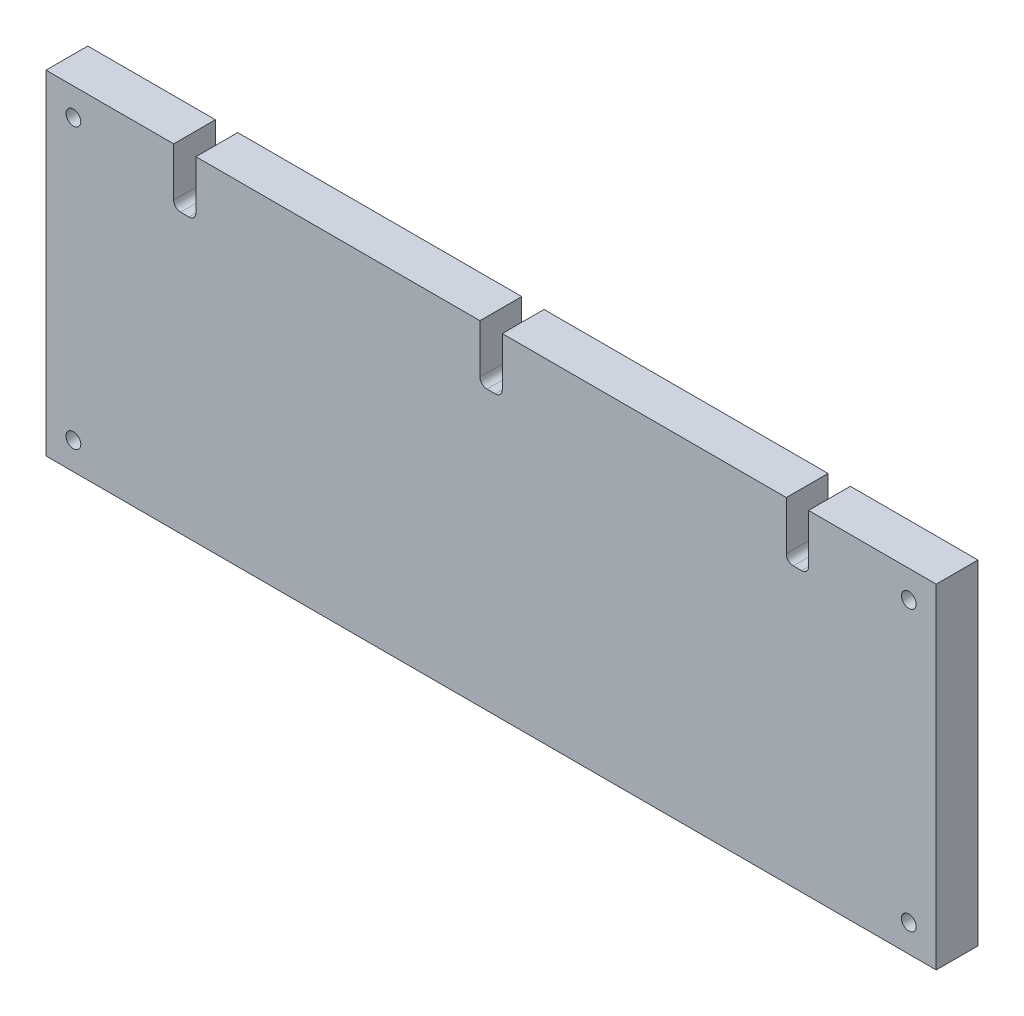
ISO-10303-21;
HEADER;
FILE_DESCRIPTION(('STEP AP214'),'2;1');
FILE_NAME('part.step','',(''),(''),'','','');
FILE_SCHEMA(('AUTOMOTIVE_DESIGN { 1 0 10303 214 1 1 1 1 }'));
ENDSEC;
DATA;
#1=APPLICATION_CONTEXT('core data for automotive mechanical design processes');
#2=APPLICATION_PROTOCOL_DEFINITION('international standard','automotive_design',2000,#1);
#3=PRODUCT_CONTEXT('',#1,'mechanical');
#4=PRODUCT('Part','Part','',(#3));
#5=PRODUCT_RELATED_PRODUCT_CATEGORY('part','',(#4));
#6=PRODUCT_DEFINITION_FORMATION('','',#4);
#7=PRODUCT_DEFINITION_CONTEXT('part definition',#1,'design');
#8=PRODUCT_DEFINITION('design','',#6,#7);
#9=PRODUCT_DEFINITION_SHAPE('','',#8);
#10=(LENGTH_UNIT() NAMED_UNIT(*) SI_UNIT(.MILLI.,.METRE.));
#11=(NAMED_UNIT(*) PLANE_ANGLE_UNIT() SI_UNIT($,.RADIAN.));
#12=(NAMED_UNIT(*) SI_UNIT($,.STERADIAN.) SOLID_ANGLE_UNIT());
#13=UNCERTAINTY_MEASURE_WITH_UNIT(LENGTH_MEASURE(1.E-05),#10,'distance_accuracy_value','');
#14=(GEOMETRIC_REPRESENTATION_CONTEXT(3) GLOBAL_UNCERTAINTY_ASSIGNED_CONTEXT((#13)) GLOBAL_UNIT_ASSIGNED_CONTEXT((#10,
#11,#12)) REPRESENTATION_CONTEXT('',''));
#15=CARTESIAN_POINT('',(0.,0.,0.));
#16=DIRECTION('',(0.,0.,1.));
#17=DIRECTION('',(1.,0.,0.));
#18=AXIS2_PLACEMENT_3D('',#15,#16,#17);
#19=CARTESIAN_POINT('',(-229.,139.9,19.05));
#20=DIRECTION('',(0.,-1.,0.));
#21=DIRECTION('',(1.,0.,0.));
#22=AXIS2_PLACEMENT_3D('',#19,#20,#21);
#23=PLANE('',#22);
#24=DIRECTION('',(-1.,0.,0.));
#25=VECTOR('',#24,1.);
#26=CARTESIAN_POINT('',(-229.,139.9,0.));
#27=LINE('',#26,#25);
#28=CARTESIAN_POINT('',(-229.,139.9,0.));
#29=VERTEX_POINT('',#28);
#30=CARTESIAN_POINT('',(-287.22,139.9,0.));
#31=VERTEX_POINT('',#30);
#32=EDGE_CURVE('E222',#29,#31,#27,.T.);
#33=ORIENTED_EDGE('',*,*,#32,.T.);
#34=DIRECTION('',(0.,0.,1.));
#35=VECTOR('',#34,1.);
#36=CARTESIAN_POINT('',(-287.22,139.9,0.));
#37=LINE('',#36,#35);
#38=CARTESIAN_POINT('',(-287.22,139.9,19.05));
#39=VERTEX_POINT('',#38);
#40=EDGE_CURVE('E292',#31,#39,#37,.T.);
#41=ORIENTED_EDGE('',*,*,#40,.T.);
#42=DIRECTION('',(-1.,0.,0.));
#43=VECTOR('',#42,1.);
#44=CARTESIAN_POINT('',(-229.,139.9,19.05));
#45=LINE('',#44,#43);
#46=CARTESIAN_POINT('',(-229.,139.9,19.05));
#47=VERTEX_POINT('',#46);
#48=EDGE_CURVE('E274',#47,#39,#45,.T.);
#49=ORIENTED_EDGE('',*,*,#48,.F.);
#50=DIRECTION('',(0.,0.,-1.));
#51=VECTOR('',#50,1.);
#52=CARTESIAN_POINT('',(-229.,139.9,19.05));
#53=LINE('',#52,#51);
#54=EDGE_CURVE('E11',#47,#29,#53,.T.);
#55=ORIENTED_EDGE('',*,*,#54,.T.);
#56=EDGE_LOOP('',(#33,#41,#49,#55));
#57=FACE_BOUND('',#56,.T.);
#58=ADVANCED_FACE('F41',(#57),#23,.F.);
#59=CARTESIAN_POINT('',(-437.08,139.9,0.));
#60=VERTEX_POINT('',#59);
#61=CARTESIAN_POINT('',(-566.62,139.9,0.));
#62=VERTEX_POINT('',#61);
#63=EDGE_CURVE('E211',#60,#62,#27,.T.);
#64=ORIENTED_EDGE('',*,*,#63,.T.);
#65=DIRECTION('',(0.,0.,1.));
#66=VECTOR('',#65,1.);
#67=CARTESIAN_POINT('',(-566.62,139.9,0.));
#68=LINE('',#67,#66);
#69=CARTESIAN_POINT('',(-566.62,139.9,19.05));
#70=VERTEX_POINT('',#69);
#71=EDGE_CURVE('E192',#62,#70,#68,.T.);
#72=ORIENTED_EDGE('',*,*,#71,.T.);
#73=CARTESIAN_POINT('',(-437.08,139.9,19.05));
#74=VERTEX_POINT('',#73);
#75=EDGE_CURVE('E279',#74,#70,#45,.T.);
#76=ORIENTED_EDGE('',*,*,#75,.F.);
#77=DIRECTION('',(0.,0.,1.));
#78=VECTOR('',#77,1.);
#79=CARTESIAN_POINT('',(-437.08,139.9,0.));
#80=LINE('',#79,#78);
#81=EDGE_CURVE('E218',#60,#74,#80,.T.);
#82=ORIENTED_EDGE('',*,*,#81,.F.);
#83=EDGE_LOOP('',(#64,#72,#76,#82));
#84=FACE_BOUND('',#83,.T.);
#85=ADVANCED_FACE('F217',(#84),#23,.F.);
#86=CARTESIAN_POINT('',(-297.38,139.9,19.05));
#87=VERTEX_POINT('',#86);
#88=CARTESIAN_POINT('',(-426.92,139.9,19.05));
#89=VERTEX_POINT('',#88);
#90=EDGE_CURVE('E278',#87,#89,#45,.T.);
#91=ORIENTED_EDGE('',*,*,#90,.F.);
#92=DIRECTION('',(0.,0.,1.));
#93=VECTOR('',#92,1.);
#94=CARTESIAN_POINT('',(-297.38,139.9,0.));
#95=LINE('',#94,#93);
#96=CARTESIAN_POINT('',(-297.38,139.9,0.));
#97=VERTEX_POINT('',#96);
#98=EDGE_CURVE('E348',#97,#87,#95,.T.);
#99=ORIENTED_EDGE('',*,*,#98,.F.);
#100=CARTESIAN_POINT('',(-426.92,139.9,0.));
#101=VERTEX_POINT('',#100);
#102=EDGE_CURVE('E219',#97,#101,#27,.T.);
#103=ORIENTED_EDGE('',*,*,#102,.T.);
#104=DIRECTION('',(0.,0.,1.));
#105=VECTOR('',#104,1.);
#106=CARTESIAN_POINT('',(-426.92,139.9,0.));
#107=LINE('',#106,#105);
#108=EDGE_CURVE('E366',#101,#89,#107,.T.);
#109=ORIENTED_EDGE('',*,*,#108,.T.);
#110=EDGE_LOOP('',(#91,#99,#103,#109));
#111=FACE_BOUND('',#110,.T.);
#112=ADVANCED_FACE('F394',(#111),#23,.F.);
#113=CARTESIAN_POINT('',(0.,0.,19.05));
#114=DIRECTION('',(0.,0.,1.));
#115=DIRECTION('',(1.,0.,0.));
#116=AXIS2_PLACEMENT_3D('',#113,#114,#115);
#117=PLANE('',#116);
#118=DIRECTION('',(0.,1.,0.));
#119=VECTOR('',#118,1.);
#120=CARTESIAN_POINT('',(-566.62,117.675,19.05));
#121=LINE('',#120,#119);
#122=CARTESIAN_POINT('',(-566.62,117.675,19.05));
#123=VERTEX_POINT('',#122);
#124=EDGE_CURVE('E198',#123,#70,#121,.T.);
#125=ORIENTED_EDGE('',*,*,#124,.F.);
#126=CARTESIAN_POINT('',(-569.795,117.675,19.05));
#127=DIRECTION('',(0.,0.,1.));
#128=DIRECTION('',(1.,0.,0.));
#129=AXIS2_PLACEMENT_3D('',#126,#127,#128);
#130=CIRCLE('',#129,3.17499999999999);
#131=CARTESIAN_POINT('',(-569.795,114.5,19.05));
#132=VERTEX_POINT('',#131);
#133=EDGE_CURVE('E214',#132,#123,#130,.T.);
#134=ORIENTED_EDGE('',*,*,#133,.F.);
#135=DIRECTION('',(1.,0.,0.));
#136=VECTOR('',#135,1.);
#137=CARTESIAN_POINT('',(-573.605,114.5,19.05));
#138=LINE('',#137,#136);
#139=CARTESIAN_POINT('',(-573.605,114.5,19.05));
#140=VERTEX_POINT('',#139);
#141=EDGE_CURVE('E415',#140,#132,#138,.T.);
#142=ORIENTED_EDGE('',*,*,#141,.F.);
#143=CARTESIAN_POINT('',(-573.605,117.675,19.05));
#144=DIRECTION('',(0.,0.,1.));
#145=DIRECTION('',(-1.,0.,0.));
#146=AXIS2_PLACEMENT_3D('',#143,#144,#145);
#147=CIRCLE('',#146,3.17499999999999);
#148=CARTESIAN_POINT('',(-576.78,117.675,19.05));
#149=VERTEX_POINT('',#148);
#150=EDGE_CURVE('E413',#149,#140,#147,.T.);
#151=ORIENTED_EDGE('',*,*,#150,.F.);
#152=DIRECTION('',(0.,-1.,0.));
#153=VECTOR('',#152,1.);
#154=CARTESIAN_POINT('',(-576.78,117.675,19.05));
#155=LINE('',#154,#153);
#156=CARTESIAN_POINT('',(-576.78,139.9,19.05));
#157=VERTEX_POINT('',#156);
#158=EDGE_CURVE('E410',#157,#149,#155,.T.);
#159=ORIENTED_EDGE('',*,*,#158,.F.);
#160=CARTESIAN_POINT('',(-635.,139.9,19.05));
#161=VERTEX_POINT('',#160);
#162=EDGE_CURVE('E273',#157,#161,#45,.T.);
#163=ORIENTED_EDGE('',*,*,#162,.T.);
#164=DIRECTION('',(0.,-1.,0.));
#165=VECTOR('',#164,1.);
#166=CARTESIAN_POINT('',(-635.,-12.5,19.05));
#167=LINE('',#166,#165);
#168=CARTESIAN_POINT('',(-635.,-12.5,19.05));
#169=VERTEX_POINT('',#168);
#170=EDGE_CURVE('E277',#161,#169,#167,.T.);
#171=ORIENTED_EDGE('',*,*,#170,.T.);
#172=DIRECTION('',(1.,0.,0.));
#173=VECTOR('',#172,1.);
#174=CARTESIAN_POINT('',(-229.,-12.5,19.05));
#175=LINE('',#174,#173);
#176=CARTESIAN_POINT('',(-229.,-12.5,19.05));
#177=VERTEX_POINT('',#176);
#178=EDGE_CURVE('E243',#169,#177,#175,.T.);
#179=ORIENTED_EDGE('',*,*,#178,.T.);
#180=DIRECTION('',(0.,1.,0.));
#181=VECTOR('',#180,1.);
#182=CARTESIAN_POINT('',(-229.,-12.5,19.05));
#183=LINE('',#182,#181);
#184=EDGE_CURVE('E236',#177,#47,#183,.T.);
#185=ORIENTED_EDGE('',*,*,#184,.T.);
#186=ORIENTED_EDGE('',*,*,#48,.T.);
#187=DIRECTION('',(0.,1.,0.));
#188=VECTOR('',#187,1.);
#189=CARTESIAN_POINT('',(-287.22,117.675,19.05));
#190=LINE('',#189,#188);
#191=CARTESIAN_POINT('',(-287.22,117.675,19.05));
#192=VERTEX_POINT('',#191);
#193=EDGE_CURVE('E327',#192,#39,#190,.T.);
#194=ORIENTED_EDGE('',*,*,#193,.F.);
#195=CARTESIAN_POINT('',(-290.395,117.675,19.05));
#196=DIRECTION('',(0.,0.,1.));
#197=DIRECTION('',(1.,0.,0.));
#198=AXIS2_PLACEMENT_3D('',#195,#196,#197);
#199=CIRCLE('',#198,3.17499999999999);
#200=CARTESIAN_POINT('',(-290.395,114.5,19.05));
#201=VERTEX_POINT('',#200);
#202=EDGE_CURVE('E318',#201,#192,#199,.T.);
#203=ORIENTED_EDGE('',*,*,#202,.F.);
#204=DIRECTION('',(1.,0.,0.));
#205=VECTOR('',#204,1.);
#206=CARTESIAN_POINT('',(-294.205,114.5,19.05));
#207=LINE('',#206,#205);
#208=CARTESIAN_POINT('',(-294.205,114.5,19.05));
#209=VERTEX_POINT('',#208);
#210=EDGE_CURVE('E335',#209,#201,#207,.T.);
#211=ORIENTED_EDGE('',*,*,#210,.F.);
#212=CARTESIAN_POINT('',(-294.205,117.675,19.05));
#213=DIRECTION('',(0.,0.,1.));
#214=DIRECTION('',(-1.,0.,0.));
#215=AXIS2_PLACEMENT_3D('',#212,#213,#214);
#216=CIRCLE('',#215,3.17499999999999);
#217=CARTESIAN_POINT('',(-297.38,117.675,19.05));
#218=VERTEX_POINT('',#217);
#219=EDGE_CURVE('E332',#218,#209,#216,.T.);
#220=ORIENTED_EDGE('',*,*,#219,.F.);
#221=DIRECTION('',(0.,-1.,0.));
#222=VECTOR('',#221,1.);
#223=CARTESIAN_POINT('',(-297.38,117.675,19.05));
#224=LINE('',#223,#222);
#225=EDGE_CURVE('E329',#87,#218,#224,.T.);
#226=ORIENTED_EDGE('',*,*,#225,.F.);
#227=ORIENTED_EDGE('',*,*,#90,.T.);
#228=DIRECTION('',(0.,1.,0.));
#229=VECTOR('',#228,1.);
#230=CARTESIAN_POINT('',(-426.92,117.675,19.05));
#231=LINE('',#230,#229);
#232=CARTESIAN_POINT('',(-426.92,117.675,19.05));
#233=VERTEX_POINT('',#232);
#234=EDGE_CURVE('E367',#233,#89,#231,.T.);
#235=ORIENTED_EDGE('',*,*,#234,.F.);
#236=CARTESIAN_POINT('',(-430.095,117.675,19.05));
#237=DIRECTION('',(0.,0.,1.));
#238=DIRECTION('',(1.,0.,0.));
#239=AXIS2_PLACEMENT_3D('',#236,#237,#238);
#240=CIRCLE('',#239,3.17499999999999);
#241=CARTESIAN_POINT('',(-430.095,114.5,19.05));
#242=VERTEX_POINT('',#241);
#243=EDGE_CURVE('E355',#242,#233,#240,.T.);
#244=ORIENTED_EDGE('',*,*,#243,.F.);
#245=DIRECTION('',(1.,0.,0.));
#246=VECTOR('',#245,1.);
#247=CARTESIAN_POINT('',(-433.905,114.5,19.05));
#248=LINE('',#247,#246);
#249=CARTESIAN_POINT('',(-433.905,114.5,19.05));
#250=VERTEX_POINT('',#249);
#251=EDGE_CURVE('E377',#250,#242,#248,.T.);
#252=ORIENTED_EDGE('',*,*,#251,.F.);
#253=CARTESIAN_POINT('',(-433.905,117.675,19.05));
#254=DIRECTION('',(0.,0.,1.));
#255=DIRECTION('',(-1.,0.,0.));
#256=AXIS2_PLACEMENT_3D('',#253,#254,#255);
#257=CIRCLE('',#256,3.17499999999999);
#258=CARTESIAN_POINT('',(-437.08,117.675,19.05));
#259=VERTEX_POINT('',#258);
#260=EDGE_CURVE('E374',#259,#250,#257,.T.);
#261=ORIENTED_EDGE('',*,*,#260,.F.);
#262=DIRECTION('',(0.,-1.,0.));
#263=VECTOR('',#262,1.);
#264=CARTESIAN_POINT('',(-437.08,117.675,19.05));
#265=LINE('',#264,#263);
#266=EDGE_CURVE('E370',#74,#259,#265,.T.);
#267=ORIENTED_EDGE('',*,*,#266,.F.);
#268=ORIENTED_EDGE('',*,*,#75,.T.);
#269=EDGE_LOOP('',(#125,#134,#142,#151,#159,#163,#171,#179,#185,#186,#194,#203,#211,#220,#226,
#227,#235,#244,#252,#261,#267,#268));
#270=FACE_BOUND('',#269,.T.);
#271=CARTESIAN_POINT('',(-622.5032,127.4032,19.05));
#272=DIRECTION('',(0.,0.,1.));
#273=DIRECTION('',(1.,0.,0.));
#274=AXIS2_PLACEMENT_3D('',#271,#272,#273);
#275=CIRCLE('',#274,3.36549999999999);
#276=CARTESIAN_POINT('',(-619.1377,127.4032,19.05));
#277=VERTEX_POINT('',#276);
#278=EDGE_CURVE('E259',#277,#277,#275,.T.);
#279=ORIENTED_EDGE('',*,*,#278,.F.);
#280=EDGE_LOOP('',(#279));
#281=FACE_BOUND('',#280,.T.);
#282=CARTESIAN_POINT('',(-241.4968,127.4032,19.05));
#283=DIRECTION('',(0.,0.,1.));
#284=DIRECTION('',(1.,0.,0.));
#285=AXIS2_PLACEMENT_3D('',#282,#283,#284);
#286=CIRCLE('',#285,3.36549999999999);
#287=CARTESIAN_POINT('',(-244.8623,127.4032,19.05));
#288=VERTEX_POINT('',#287);
#289=EDGE_CURVE('E248',#288,#288,#286,.F.);
#290=ORIENTED_EDGE('',*,*,#289,.T.);
#291=EDGE_LOOP('',(#290));
#292=FACE_BOUND('',#291,.T.);
#293=CARTESIAN_POINT('',(-241.5,0.,19.05));
#294=DIRECTION('',(0.,0.,1.));
#295=DIRECTION('',(1.,0.,0.));
#296=AXIS2_PLACEMENT_3D('',#293,#294,#295);
#297=CIRCLE('',#296,3.36549999999999);
#298=CARTESIAN_POINT('',(-244.8655,0.,19.05));
#299=VERTEX_POINT('',#298);
#300=EDGE_CURVE('E266',#299,#299,#297,.T.);
#301=ORIENTED_EDGE('',*,*,#300,.F.);
#302=EDGE_LOOP('',(#301));
#303=FACE_BOUND('',#302,.T.);
#304=CARTESIAN_POINT('',(-622.5,0.,19.05));
#305=DIRECTION('',(0.,0.,1.));
#306=DIRECTION('',(-1.,0.,0.));
#307=AXIS2_PLACEMENT_3D('',#304,#305,#306);
#308=CIRCLE('',#307,3.36550000000002);
#309=CARTESIAN_POINT('',(-625.8655,0.,19.05));
#310=VERTEX_POINT('',#309);
#311=EDGE_CURVE('E252',#310,#310,#308,.T.);
#312=ORIENTED_EDGE('',*,*,#311,.F.);
#313=EDGE_LOOP('',(#312));
#314=FACE_BOUND('',#313,.T.);
#315=ADVANCED_FACE('F295',(#270,#281,#292,#303,#314),#117,.T.);
#316=CARTESIAN_POINT('',(0.,0.,0.));
#317=DIRECTION('',(0.,0.,1.));
#318=DIRECTION('',(1.,0.,0.));
#319=AXIS2_PLACEMENT_3D('',#316,#317,#318);
#320=PLANE('',#319);
#321=CARTESIAN_POINT('',(-622.5032,127.4032,0.));
#322=DIRECTION('',(0.,0.,1.));
#323=DIRECTION('',(1.,0.,0.));
#324=AXIS2_PLACEMENT_3D('',#321,#322,#323);
#325=CIRCLE('',#324,3.36549999999999);
#326=CARTESIAN_POINT('',(-619.1377,127.4032,0.));
#327=VERTEX_POINT('',#326);
#328=EDGE_CURVE('E45',#327,#327,#325,.F.);
#329=ORIENTED_EDGE('',*,*,#328,.F.);
#330=EDGE_LOOP('',(#329));
#331=FACE_BOUND('',#330,.T.);
#332=CARTESIAN_POINT('',(-241.4968,127.4032,0.));
#333=DIRECTION('',(0.,0.,1.));
#334=DIRECTION('',(1.,0.,0.));
#335=AXIS2_PLACEMENT_3D('',#332,#333,#334);
#336=CIRCLE('',#335,3.36549999999999);
#337=CARTESIAN_POINT('',(-244.8623,127.4032,0.));
#338=VERTEX_POINT('',#337);
#339=EDGE_CURVE('E245',#338,#338,#336,.T.);
#340=ORIENTED_EDGE('',*,*,#339,.T.);
#341=EDGE_LOOP('',(#340));
#342=FACE_BOUND('',#341,.T.);
#343=CARTESIAN_POINT('',(-569.795,117.675,0.));
#344=DIRECTION('',(0.,0.,1.));
#345=DIRECTION('',(1.,0.,0.));
#346=AXIS2_PLACEMENT_3D('',#343,#344,#345);
#347=CIRCLE('',#346,3.17499999999999);
#348=CARTESIAN_POINT('',(-569.795,114.5,0.));
#349=VERTEX_POINT('',#348);
#350=CARTESIAN_POINT('',(-566.62,117.675,0.));
#351=VERTEX_POINT('',#350);
#352=EDGE_CURVE('E204',#349,#351,#347,.T.);
#353=ORIENTED_EDGE('',*,*,#352,.T.);
#354=DIRECTION('',(0.,1.,0.));
#355=VECTOR('',#354,1.);
#356=CARTESIAN_POINT('',(-566.62,117.675,0.));
#357=LINE('',#356,#355);
#358=EDGE_CURVE('E195',#351,#62,#357,.T.);
#359=ORIENTED_EDGE('',*,*,#358,.T.);
#360=ORIENTED_EDGE('',*,*,#63,.F.);
#361=DIRECTION('',(0.,-1.,0.));
#362=VECTOR('',#361,1.);
#363=CARTESIAN_POINT('',(-437.08,117.675,0.));
#364=LINE('',#363,#362);
#365=CARTESIAN_POINT('',(-437.08,117.675,0.));
#366=VERTEX_POINT('',#365);
#367=EDGE_CURVE('E354',#60,#366,#364,.T.);
#368=ORIENTED_EDGE('',*,*,#367,.T.);
#369=CARTESIAN_POINT('',(-433.905,117.675,0.));
#370=DIRECTION('',(0.,0.,1.));
#371=DIRECTION('',(-1.,0.,0.));
#372=AXIS2_PLACEMENT_3D('',#369,#370,#371);
#373=CIRCLE('',#372,3.17499999999999);
#374=CARTESIAN_POINT('',(-433.905,114.5,0.));
#375=VERTEX_POINT('',#374);
#376=EDGE_CURVE('E357',#366,#375,#373,.T.);
#377=ORIENTED_EDGE('',*,*,#376,.T.);
#378=DIRECTION('',(1.,0.,0.));
#379=VECTOR('',#378,1.);
#380=CARTESIAN_POINT('',(-433.905,114.5,0.));
#381=LINE('',#380,#379);
#382=CARTESIAN_POINT('',(-430.095,114.5,0.));
#383=VERTEX_POINT('',#382);
#384=EDGE_CURVE('E360',#375,#383,#381,.T.);
#385=ORIENTED_EDGE('',*,*,#384,.T.);
#386=CARTESIAN_POINT('',(-430.095,117.675,0.));
#387=DIRECTION('',(0.,0.,1.));
#388=DIRECTION('',(1.,0.,0.));
#389=AXIS2_PLACEMENT_3D('',#386,#387,#388);
#390=CIRCLE('',#389,3.17499999999999);
#391=CARTESIAN_POINT('',(-426.92,117.675,0.));
#392=VERTEX_POINT('',#391);
#393=EDGE_CURVE('E363',#383,#392,#390,.T.);
#394=ORIENTED_EDGE('',*,*,#393,.T.);
#395=DIRECTION('',(0.,1.,0.));
#396=VECTOR('',#395,1.);
#397=CARTESIAN_POINT('',(-426.92,117.675,0.));
#398=LINE('',#397,#396);
#399=EDGE_CURVE('E351',#392,#101,#398,.T.);
#400=ORIENTED_EDGE('',*,*,#399,.T.);
#401=ORIENTED_EDGE('',*,*,#102,.F.);
#402=DIRECTION('',(0.,-1.,0.));
#403=VECTOR('',#402,1.);
#404=CARTESIAN_POINT('',(-297.38,117.675,0.));
#405=LINE('',#404,#403);
#406=CARTESIAN_POINT('',(-297.38,117.675,0.));
#407=VERTEX_POINT('',#406);
#408=EDGE_CURVE('E317',#97,#407,#405,.T.);
#409=ORIENTED_EDGE('',*,*,#408,.T.);
#410=CARTESIAN_POINT('',(-294.205,117.675,0.));
#411=DIRECTION('',(0.,0.,1.));
#412=DIRECTION('',(-1.,0.,0.));
#413=AXIS2_PLACEMENT_3D('',#410,#411,#412);
#414=CIRCLE('',#413,3.17499999999999);
#415=CARTESIAN_POINT('',(-294.205,114.5,0.));
#416=VERTEX_POINT('',#415);
#417=EDGE_CURVE('E58',#407,#416,#414,.T.);
#418=ORIENTED_EDGE('',*,*,#417,.T.);
#419=DIRECTION('',(1.,0.,0.));
#420=VECTOR('',#419,1.);
#421=CARTESIAN_POINT('',(-294.205,114.5,0.));
#422=LINE('',#421,#420);
#423=CARTESIAN_POINT('',(-290.395,114.5,0.));
#424=VERTEX_POINT('',#423);
#425=EDGE_CURVE('E322',#416,#424,#422,.T.);
#426=ORIENTED_EDGE('',*,*,#425,.T.);
#427=CARTESIAN_POINT('',(-290.395,117.675,0.));
#428=DIRECTION('',(0.,0.,1.));
#429=DIRECTION('',(1.,0.,0.));
#430=AXIS2_PLACEMENT_3D('',#427,#428,#429);
#431=CIRCLE('',#430,3.17499999999999);
#432=CARTESIAN_POINT('',(-287.22,117.675,0.));
#433=VERTEX_POINT('',#432);
#434=EDGE_CURVE('E325',#424,#433,#431,.T.);
#435=ORIENTED_EDGE('',*,*,#434,.T.);
#436=DIRECTION('',(0.,1.,0.));
#437=VECTOR('',#436,1.);
#438=CARTESIAN_POINT('',(-287.22,117.675,0.));
#439=LINE('',#438,#437);
#440=EDGE_CURVE('E291',#433,#31,#439,.T.);
#441=ORIENTED_EDGE('',*,*,#440,.T.);
#442=ORIENTED_EDGE('',*,*,#32,.F.);
#443=DIRECTION('',(0.,1.,0.));
#444=VECTOR('',#443,1.);
#445=CARTESIAN_POINT('',(-229.,-12.5,0.));
#446=LINE('',#445,#444);
#447=CARTESIAN_POINT('',(-229.,-12.5,0.));
#448=VERTEX_POINT('',#447);
#449=EDGE_CURVE('E223',#448,#29,#446,.T.);
#450=ORIENTED_EDGE('',*,*,#449,.F.);
#451=DIRECTION('',(1.,0.,0.));
#452=VECTOR('',#451,1.);
#453=CARTESIAN_POINT('',(-229.,-12.5,0.));
#454=LINE('',#453,#452);
#455=CARTESIAN_POINT('',(-635.,-12.5,0.));
#456=VERTEX_POINT('',#455);
#457=EDGE_CURVE('E230',#456,#448,#454,.T.);
#458=ORIENTED_EDGE('',*,*,#457,.F.);
#459=DIRECTION('',(0.,-1.,0.));
#460=VECTOR('',#459,1.);
#461=CARTESIAN_POINT('',(-635.,-12.5,0.));
#462=LINE('',#461,#460);
#463=CARTESIAN_POINT('',(-635.,139.9,0.));
#464=VERTEX_POINT('',#463);
#465=EDGE_CURVE('E227',#464,#456,#462,.T.);
#466=ORIENTED_EDGE('',*,*,#465,.F.);
#467=CARTESIAN_POINT('',(-576.78,139.9,0.));
#468=VERTEX_POINT('',#467);
#469=EDGE_CURVE('E220',#468,#464,#27,.T.);
#470=ORIENTED_EDGE('',*,*,#469,.F.);
#471=DIRECTION('',(0.,-1.,0.));
#472=VECTOR('',#471,1.);
#473=CARTESIAN_POINT('',(-576.78,117.675,0.));
#474=LINE('',#473,#472);
#475=CARTESIAN_POINT('',(-576.78,117.675,0.));
#476=VERTEX_POINT('',#475);
#477=EDGE_CURVE('E66',#468,#476,#474,.T.);
#478=ORIENTED_EDGE('',*,*,#477,.T.);
#479=CARTESIAN_POINT('',(-573.605,117.675,0.));
#480=DIRECTION('',(0.,0.,1.));
#481=DIRECTION('',(-1.,0.,0.));
#482=AXIS2_PLACEMENT_3D('',#479,#480,#481);
#483=CIRCLE('',#482,3.17499999999999);
#484=CARTESIAN_POINT('',(-573.605,114.5,0.));
#485=VERTEX_POINT('',#484);
#486=EDGE_CURVE('E436',#476,#485,#483,.T.);
#487=ORIENTED_EDGE('',*,*,#486,.T.);
#488=DIRECTION('',(1.,0.,0.));
#489=VECTOR('',#488,1.);
#490=CARTESIAN_POINT('',(-573.605,114.5,0.));
#491=LINE('',#490,#489);
#492=EDGE_CURVE('E430',#485,#349,#491,.T.);
#493=ORIENTED_EDGE('',*,*,#492,.T.);
#494=EDGE_LOOP('',(#353,#359,#360,#368,#377,#385,#394,#400,#401,#409,#418,#426,#435,#441,#442,
#450,#458,#466,#470,#478,#487,#493));
#495=FACE_BOUND('',#494,.T.);
#496=CARTESIAN_POINT('',(-241.5,0.,0.));
#497=DIRECTION('',(0.,0.,1.));
#498=DIRECTION('',(1.,0.,0.));
#499=AXIS2_PLACEMENT_3D('',#496,#497,#498);
#500=CIRCLE('',#499,3.36549999999999);
#501=CARTESIAN_POINT('',(-244.8655,0.,0.));
#502=VERTEX_POINT('',#501);
#503=EDGE_CURVE('E264',#502,#502,#500,.T.);
#504=ORIENTED_EDGE('',*,*,#503,.T.);
#505=EDGE_LOOP('',(#504));
#506=FACE_BOUND('',#505,.T.);
#507=CARTESIAN_POINT('',(-622.5,0.,0.));
#508=DIRECTION('',(0.,0.,1.));
#509=DIRECTION('',(-1.,0.,0.));
#510=AXIS2_PLACEMENT_3D('',#507,#508,#509);
#511=CIRCLE('',#510,3.36550000000002);
#512=CARTESIAN_POINT('',(-625.8655,0.,0.));
#513=VERTEX_POINT('',#512);
#514=EDGE_CURVE('E247',#513,#513,#511,.T.);
#515=ORIENTED_EDGE('',*,*,#514,.T.);
#516=EDGE_LOOP('',(#515));
#517=FACE_BOUND('',#516,.T.);
#518=ADVANCED_FACE('F208',(#331,#342,#495,#506,#517),#320,.F.);
#519=CARTESIAN_POINT('',(-229.,-12.5,19.05));
#520=DIRECTION('',(-1.,0.,0.));
#521=DIRECTION('',(0.,-1.,0.));
#522=AXIS2_PLACEMENT_3D('',#519,#520,#521);
#523=PLANE('',#522);
#524=ORIENTED_EDGE('',*,*,#449,.T.);
#525=ORIENTED_EDGE('',*,*,#54,.F.);
#526=ORIENTED_EDGE('',*,*,#184,.F.);
#527=DIRECTION('',(0.,0.,-1.));
#528=VECTOR('',#527,1.);
#529=CARTESIAN_POINT('',(-229.,-12.5,19.05));
#530=LINE('',#529,#528);
#531=EDGE_CURVE('E239',#177,#448,#530,.T.);
#532=ORIENTED_EDGE('',*,*,#531,.T.);
#533=EDGE_LOOP('',(#524,#525,#526,#532));
#534=FACE_BOUND('',#533,.T.);
#535=ADVANCED_FACE('F43',(#534),#523,.F.);
#536=ORIENTED_EDGE('',*,*,#162,.F.);
#537=DIRECTION('',(0.,0.,1.));
#538=VECTOR('',#537,1.);
#539=CARTESIAN_POINT('',(-576.78,139.9,0.));
#540=LINE('',#539,#538);
#541=EDGE_CURVE('E203',#468,#157,#540,.T.);
#542=ORIENTED_EDGE('',*,*,#541,.F.);
#543=ORIENTED_EDGE('',*,*,#469,.T.);
#544=DIRECTION('',(0.,0.,-1.));
#545=VECTOR('',#544,1.);
#546=CARTESIAN_POINT('',(-635.,139.9,19.05));
#547=LINE('',#546,#545);
#548=EDGE_CURVE('E50',#161,#464,#547,.T.);
#549=ORIENTED_EDGE('',*,*,#548,.F.);
#550=EDGE_LOOP('',(#536,#542,#543,#549));
#551=FACE_BOUND('',#550,.T.);
#552=ADVANCED_FACE('F307',(#551),#23,.F.);
#553=CARTESIAN_POINT('',(-635.,-12.5,19.05));
#554=DIRECTION('',(1.,0.,0.));
#555=DIRECTION('',(0.,1.,0.));
#556=AXIS2_PLACEMENT_3D('',#553,#554,#555);
#557=PLANE('',#556);
#558=ORIENTED_EDGE('',*,*,#465,.T.);
#559=DIRECTION('',(0.,0.,-1.));
#560=VECTOR('',#559,1.);
#561=CARTESIAN_POINT('',(-635.,-12.5,19.05));
#562=LINE('',#561,#560);
#563=EDGE_CURVE('E242',#169,#456,#562,.T.);
#564=ORIENTED_EDGE('',*,*,#563,.F.);
#565=ORIENTED_EDGE('',*,*,#170,.F.);
#566=ORIENTED_EDGE('',*,*,#548,.T.);
#567=EDGE_LOOP('',(#558,#564,#565,#566));
#568=FACE_BOUND('',#567,.T.);
#569=ADVANCED_FACE('F301',(#568),#557,.F.);
#570=CARTESIAN_POINT('',(-229.,-12.5,19.05));
#571=DIRECTION('',(0.,1.,0.));
#572=DIRECTION('',(-1.,0.,0.));
#573=AXIS2_PLACEMENT_3D('',#570,#571,#572);
#574=PLANE('',#573);
#575=ORIENTED_EDGE('',*,*,#457,.T.);
#576=ORIENTED_EDGE('',*,*,#531,.F.);
#577=ORIENTED_EDGE('',*,*,#178,.F.);
#578=ORIENTED_EDGE('',*,*,#563,.T.);
#579=EDGE_LOOP('',(#575,#576,#577,#578));
#580=FACE_BOUND('',#579,.T.);
#581=ADVANCED_FACE('F300',(#580),#574,.F.);
#582=CARTESIAN_POINT('',(-241.5,0.,19.05));
#583=DIRECTION('',(0.,0.,-1.));
#584=DIRECTION('',(-1.,0.,0.));
#585=AXIS2_PLACEMENT_3D('',#582,#583,#584);
#586=CYLINDRICAL_SURFACE('',#585,3.36549999999999);
#587=CARTESIAN_POINT('',(-244.8655,0.,19.05));
#588=CARTESIAN_POINT('',(-244.8655,0.,18.8515625));
#589=CARTESIAN_POINT('',(-244.8655,0.,18.653125));
#590=CARTESIAN_POINT('',(-244.8655,0.,18.25625));
#591=CARTESIAN_POINT('',(-244.8655,0.,18.0578125));
#592=CARTESIAN_POINT('',(-244.8655,0.,17.6609375));
#593=CARTESIAN_POINT('',(-244.8655,0.,17.4625));
#594=CARTESIAN_POINT('',(-244.8655,0.,17.065625));
#595=CARTESIAN_POINT('',(-244.8655,0.,16.8671875));
#596=CARTESIAN_POINT('',(-244.8655,0.,16.4703125));
#597=CARTESIAN_POINT('',(-244.8655,0.,16.271875));
#598=CARTESIAN_POINT('',(-244.8655,0.,15.875));
#599=CARTESIAN_POINT('',(-244.8655,0.,15.6765625));
#600=CARTESIAN_POINT('',(-244.8655,0.,15.2796875));
#601=CARTESIAN_POINT('',(-244.8655,0.,15.08125));
#602=CARTESIAN_POINT('',(-244.8655,0.,14.684375));
#603=CARTESIAN_POINT('',(-244.8655,0.,14.4859375));
#604=CARTESIAN_POINT('',(-244.8655,0.,14.0890625));
#605=CARTESIAN_POINT('',(-244.8655,0.,13.890625));
#606=CARTESIAN_POINT('',(-244.8655,0.,13.49375));
#607=CARTESIAN_POINT('',(-244.8655,0.,13.2953125));
#608=CARTESIAN_POINT('',(-244.8655,0.,12.8984375));
#609=CARTESIAN_POINT('',(-244.8655,0.,12.7));
#610=CARTESIAN_POINT('',(-244.8655,0.,12.303125));
#611=CARTESIAN_POINT('',(-244.8655,0.,12.1046875));
#612=CARTESIAN_POINT('',(-244.8655,0.,11.7078125));
#613=CARTESIAN_POINT('',(-244.8655,0.,11.509375));
#614=CARTESIAN_POINT('',(-244.8655,0.,11.1125));
#615=CARTESIAN_POINT('',(-244.8655,0.,10.9140625));
#616=CARTESIAN_POINT('',(-244.8655,0.,10.5171875));
#617=CARTESIAN_POINT('',(-244.8655,0.,10.31875));
#618=CARTESIAN_POINT('',(-244.8655,0.,9.921875));
#619=CARTESIAN_POINT('',(-244.8655,0.,9.7234375));
#620=CARTESIAN_POINT('',(-244.8655,0.,9.3265625));
#621=CARTESIAN_POINT('',(-244.8655,0.,9.128125));
#622=CARTESIAN_POINT('',(-244.8655,0.,8.73125));
#623=CARTESIAN_POINT('',(-244.8655,0.,8.5328125));
#624=CARTESIAN_POINT('',(-244.8655,0.,8.1359375));
#625=CARTESIAN_POINT('',(-244.8655,0.,7.9375));
#626=CARTESIAN_POINT('',(-244.8655,0.,7.540625));
#627=CARTESIAN_POINT('',(-244.8655,0.,7.3421875));
#628=CARTESIAN_POINT('',(-244.8655,0.,6.9453125));
#629=CARTESIAN_POINT('',(-244.8655,0.,6.746875));
#630=CARTESIAN_POINT('',(-244.8655,0.,6.35));
#631=CARTESIAN_POINT('',(-244.8655,0.,6.1515625));
#632=CARTESIAN_POINT('',(-244.8655,0.,5.7546875));
#633=CARTESIAN_POINT('',(-244.8655,0.,5.55625));
#634=CARTESIAN_POINT('',(-244.8655,0.,5.159375));
#635=CARTESIAN_POINT('',(-244.8655,0.,4.9609375));
#636=CARTESIAN_POINT('',(-244.8655,0.,4.5640625));
#637=CARTESIAN_POINT('',(-244.8655,0.,4.365625));
#638=CARTESIAN_POINT('',(-244.8655,0.,3.96875));
#639=CARTESIAN_POINT('',(-244.8655,0.,3.7703125));
#640=CARTESIAN_POINT('',(-244.8655,0.,3.3734375));
#641=CARTESIAN_POINT('',(-244.8655,0.,3.175));
#642=CARTESIAN_POINT('',(-244.8655,0.,2.778125));
#643=CARTESIAN_POINT('',(-244.8655,0.,2.5796875));
#644=CARTESIAN_POINT('',(-244.8655,0.,2.1828125));
#645=CARTESIAN_POINT('',(-244.8655,0.,1.984375));
#646=CARTESIAN_POINT('',(-244.8655,0.,1.5875));
#647=CARTESIAN_POINT('',(-244.8655,0.,1.3890625));
#648=CARTESIAN_POINT('',(-244.8655,0.,0.992187500000001));
#649=CARTESIAN_POINT('',(-244.8655,0.,0.793750000000001));
#650=CARTESIAN_POINT('',(-244.8655,0.,0.396875));
#651=CARTESIAN_POINT('',(-244.8655,0.,0.1984375));
#652=CARTESIAN_POINT('',(-244.8655,0.,0.));
#653=B_SPLINE_CURVE_WITH_KNOTS('',3,(#587,#588,#589,#590,#591,#592,#593,#594,#595,#596,#597,
#598,#599,#600,#601,#602,#603,#604,#605,#606,#607,#608,#609,#610,#611,#612,#613,#614,#615,#616,
#617,#618,#619,#620,#621,#622,#623,#624,#625,#626,#627,#628,#629,#630,#631,#632,#633,#634,#635,
#636,#637,#638,#639,#640,#641,#642,#643,#644,#645,#646,#647,#648,#649,#650,#651,#652),
.UNSPECIFIED.,.F.,.F.,(4,2,2,2,2,2,2,2,2,2,2,2,2,2,2,2,2,2,2,2,2,2,2,2,2,2,2,2,2,2,2,2,4),(0.,
0.595312499999997,1.190625,1.7859375,2.38125,2.9765625,3.571875,4.1671875,4.7625,5.3578125,
5.953125,6.5484375,7.14375,7.7390625,8.334375,8.9296875,9.525,10.1203125,10.715625,11.3109375,
11.90625,12.5015625,13.096875,13.6921875,14.2875,14.8828125,15.478125,16.0734375,16.66875,
17.2640625,17.859375,18.4546875,19.05),.UNSPECIFIED.);
#654=EDGE_CURVE('BSEAM470',#299,#502,#653,.T.);
#655=ORIENTED_EDGE('',*,*,#300,.T.);
#656=ORIENTED_EDGE('',*,*,#503,.F.);
#657=ORIENTED_EDGE('',*,*,#654,.T.);
#658=ORIENTED_EDGE('',*,*,#654,.F.);
#659=EDGE_LOOP('',(#655,#657,#656,#658));
#660=FACE_BOUND('',#659,.T.);
#661=ADVANCED_FACE('F470',(#660),#586,.F.);
#662=CARTESIAN_POINT('',(-622.5,0.,19.05));
#663=DIRECTION('',(0.,0.,-1.));
#664=DIRECTION('',(-1.,0.,0.));
#665=AXIS2_PLACEMENT_3D('',#662,#663,#664);
#666=CYLINDRICAL_SURFACE('',#665,3.36550000000002);
#667=CARTESIAN_POINT('',(-625.8655,0.,19.05));
#668=CARTESIAN_POINT('',(-625.8655,0.,18.8515625));
#669=CARTESIAN_POINT('',(-625.8655,0.,18.653125));
#670=CARTESIAN_POINT('',(-625.8655,0.,18.25625));
#671=CARTESIAN_POINT('',(-625.8655,0.,18.0578125));
#672=CARTESIAN_POINT('',(-625.8655,0.,17.6609375));
#673=CARTESIAN_POINT('',(-625.8655,0.,17.4625));
#674=CARTESIAN_POINT('',(-625.8655,0.,17.065625));
#675=CARTESIAN_POINT('',(-625.8655,0.,16.8671875));
#676=CARTESIAN_POINT('',(-625.8655,0.,16.4703125));
#677=CARTESIAN_POINT('',(-625.8655,0.,16.271875));
#678=CARTESIAN_POINT('',(-625.8655,0.,15.875));
#679=CARTESIAN_POINT('',(-625.8655,0.,15.6765625));
#680=CARTESIAN_POINT('',(-625.8655,0.,15.2796875));
#681=CARTESIAN_POINT('',(-625.8655,0.,15.08125));
#682=CARTESIAN_POINT('',(-625.8655,0.,14.684375));
#683=CARTESIAN_POINT('',(-625.8655,0.,14.4859375));
#684=CARTESIAN_POINT('',(-625.8655,0.,14.0890625));
#685=CARTESIAN_POINT('',(-625.8655,0.,13.890625));
#686=CARTESIAN_POINT('',(-625.8655,0.,13.49375));
#687=CARTESIAN_POINT('',(-625.8655,0.,13.2953125));
#688=CARTESIAN_POINT('',(-625.8655,0.,12.8984375));
#689=CARTESIAN_POINT('',(-625.8655,0.,12.7));
#690=CARTESIAN_POINT('',(-625.8655,0.,12.303125));
#691=CARTESIAN_POINT('',(-625.8655,0.,12.1046875));
#692=CARTESIAN_POINT('',(-625.8655,0.,11.7078125));
#693=CARTESIAN_POINT('',(-625.8655,0.,11.509375));
#694=CARTESIAN_POINT('',(-625.8655,0.,11.1125));
#695=CARTESIAN_POINT('',(-625.8655,0.,10.9140625));
#696=CARTESIAN_POINT('',(-625.8655,0.,10.5171875));
#697=CARTESIAN_POINT('',(-625.8655,0.,10.31875));
#698=CARTESIAN_POINT('',(-625.8655,0.,9.921875));
#699=CARTESIAN_POINT('',(-625.8655,0.,9.7234375));
#700=CARTESIAN_POINT('',(-625.8655,0.,9.3265625));
#701=CARTESIAN_POINT('',(-625.8655,0.,9.128125));
#702=CARTESIAN_POINT('',(-625.8655,0.,8.73125));
#703=CARTESIAN_POINT('',(-625.8655,0.,8.5328125));
#704=CARTESIAN_POINT('',(-625.8655,0.,8.1359375));
#705=CARTESIAN_POINT('',(-625.8655,0.,7.9375));
#706=CARTESIAN_POINT('',(-625.8655,0.,7.540625));
#707=CARTESIAN_POINT('',(-625.8655,0.,7.3421875));
#708=CARTESIAN_POINT('',(-625.8655,0.,6.9453125));
#709=CARTESIAN_POINT('',(-625.8655,0.,6.746875));
#710=CARTESIAN_POINT('',(-625.8655,0.,6.35));
#711=CARTESIAN_POINT('',(-625.8655,0.,6.1515625));
#712=CARTESIAN_POINT('',(-625.8655,0.,5.7546875));
#713=CARTESIAN_POINT('',(-625.8655,0.,5.55625));
#714=CARTESIAN_POINT('',(-625.8655,0.,5.159375));
#715=CARTESIAN_POINT('',(-625.8655,0.,4.9609375));
#716=CARTESIAN_POINT('',(-625.8655,0.,4.5640625));
#717=CARTESIAN_POINT('',(-625.8655,0.,4.365625));
#718=CARTESIAN_POINT('',(-625.8655,0.,3.96875));
#719=CARTESIAN_POINT('',(-625.8655,0.,3.7703125));
#720=CARTESIAN_POINT('',(-625.8655,0.,3.3734375));
#721=CARTESIAN_POINT('',(-625.8655,0.,3.175));
#722=CARTESIAN_POINT('',(-625.8655,0.,2.778125));
#723=CARTESIAN_POINT('',(-625.8655,0.,2.5796875));
#724=CARTESIAN_POINT('',(-625.8655,0.,2.1828125));
#725=CARTESIAN_POINT('',(-625.8655,0.,1.984375));
#726=CARTESIAN_POINT('',(-625.8655,0.,1.5875));
#727=CARTESIAN_POINT('',(-625.8655,0.,1.3890625));
#728=CARTESIAN_POINT('',(-625.8655,0.,0.992187500000001));
#729=CARTESIAN_POINT('',(-625.8655,0.,0.793750000000001));
#730=CARTESIAN_POINT('',(-625.8655,0.,0.396875));
#731=CARTESIAN_POINT('',(-625.8655,0.,0.1984375));
#732=CARTESIAN_POINT('',(-625.8655,0.,0.));
#733=B_SPLINE_CURVE_WITH_KNOTS('',3,(#667,#668,#669,#670,#671,#672,#673,#674,#675,#676,#677,
#678,#679,#680,#681,#682,#683,#684,#685,#686,#687,#688,#689,#690,#691,#692,#693,#694,#695,#696,
#697,#698,#699,#700,#701,#702,#703,#704,#705,#706,#707,#708,#709,#710,#711,#712,#713,#714,#715,
#716,#717,#718,#719,#720,#721,#722,#723,#724,#725,#726,#727,#728,#729,#730,#731,#732),
.UNSPECIFIED.,.F.,.F.,(4,2,2,2,2,2,2,2,2,2,2,2,2,2,2,2,2,2,2,2,2,2,2,2,2,2,2,2,2,2,2,2,4),(0.,
0.595312499999997,1.190625,1.7859375,2.38125,2.9765625,3.571875,4.1671875,4.7625,5.3578125,
5.953125,6.5484375,7.14375,7.7390625,8.334375,8.9296875,9.525,10.1203125,10.715625,11.3109375,
11.90625,12.5015625,13.096875,13.6921875,14.2875,14.8828125,15.478125,16.0734375,16.66875,
17.2640625,17.859375,18.4546875,19.05),.UNSPECIFIED.);
#734=EDGE_CURVE('BSEAM477',#310,#513,#733,.T.);
#735=ORIENTED_EDGE('',*,*,#311,.T.);
#736=ORIENTED_EDGE('',*,*,#514,.F.);
#737=ORIENTED_EDGE('',*,*,#734,.T.);
#738=ORIENTED_EDGE('',*,*,#734,.F.);
#739=EDGE_LOOP('',(#735,#737,#736,#738));
#740=FACE_BOUND('',#739,.T.);
#741=ADVANCED_FACE('F477',(#740),#666,.F.);
#742=CARTESIAN_POINT('',(-241.4968,127.4032,28.5690714883333));
#743=DIRECTION('',(0.,0.,-1.));
#744=DIRECTION('',(-1.,0.,0.));
#745=AXIS2_PLACEMENT_3D('',#742,#743,#744);
#746=CYLINDRICAL_SURFACE('',#745,3.36549999999999);
#747=CARTESIAN_POINT('',(-244.8623,127.4032,19.05));
#748=CARTESIAN_POINT('',(-244.8623,127.4032,18.8515625));
#749=CARTESIAN_POINT('',(-244.8623,127.4032,18.653125));
#750=CARTESIAN_POINT('',(-244.8623,127.4032,18.25625));
#751=CARTESIAN_POINT('',(-244.8623,127.4032,18.0578125));
#752=CARTESIAN_POINT('',(-244.8623,127.4032,17.6609375));
#753=CARTESIAN_POINT('',(-244.8623,127.4032,17.4625));
#754=CARTESIAN_POINT('',(-244.8623,127.4032,17.065625));
#755=CARTESIAN_POINT('',(-244.8623,127.4032,16.8671875));
#756=CARTESIAN_POINT('',(-244.8623,127.4032,16.4703125));
#757=CARTESIAN_POINT('',(-244.8623,127.4032,16.271875));
#758=CARTESIAN_POINT('',(-244.8623,127.4032,15.875));
#759=CARTESIAN_POINT('',(-244.8623,127.4032,15.6765625));
#760=CARTESIAN_POINT('',(-244.8623,127.4032,15.2796875));
#761=CARTESIAN_POINT('',(-244.8623,127.4032,15.08125));
#762=CARTESIAN_POINT('',(-244.8623,127.4032,14.684375));
#763=CARTESIAN_POINT('',(-244.8623,127.4032,14.4859375));
#764=CARTESIAN_POINT('',(-244.8623,127.4032,14.0890625));
#765=CARTESIAN_POINT('',(-244.8623,127.4032,13.890625));
#766=CARTESIAN_POINT('',(-244.8623,127.4032,13.49375));
#767=CARTESIAN_POINT('',(-244.8623,127.4032,13.2953125));
#768=CARTESIAN_POINT('',(-244.8623,127.4032,12.8984375));
#769=CARTESIAN_POINT('',(-244.8623,127.4032,12.7));
#770=CARTESIAN_POINT('',(-244.8623,127.4032,12.303125));
#771=CARTESIAN_POINT('',(-244.8623,127.4032,12.1046875));
#772=CARTESIAN_POINT('',(-244.8623,127.4032,11.7078125));
#773=CARTESIAN_POINT('',(-244.8623,127.4032,11.509375));
#774=CARTESIAN_POINT('',(-244.8623,127.4032,11.1125));
#775=CARTESIAN_POINT('',(-244.8623,127.4032,10.9140625));
#776=CARTESIAN_POINT('',(-244.8623,127.4032,10.5171875));
#777=CARTESIAN_POINT('',(-244.8623,127.4032,10.31875));
#778=CARTESIAN_POINT('',(-244.8623,127.4032,9.921875));
#779=CARTESIAN_POINT('',(-244.8623,127.4032,9.7234375));
#780=CARTESIAN_POINT('',(-244.8623,127.4032,9.3265625));
#781=CARTESIAN_POINT('',(-244.8623,127.4032,9.128125));
#782=CARTESIAN_POINT('',(-244.8623,127.4032,8.73125));
#783=CARTESIAN_POINT('',(-244.8623,127.4032,8.5328125));
#784=CARTESIAN_POINT('',(-244.8623,127.4032,8.1359375));
#785=CARTESIAN_POINT('',(-244.8623,127.4032,7.9375));
#786=CARTESIAN_POINT('',(-244.8623,127.4032,7.540625));
#787=CARTESIAN_POINT('',(-244.8623,127.4032,7.3421875));
#788=CARTESIAN_POINT('',(-244.8623,127.4032,6.9453125));
#789=CARTESIAN_POINT('',(-244.8623,127.4032,6.746875));
#790=CARTESIAN_POINT('',(-244.8623,127.4032,6.35));
#791=CARTESIAN_POINT('',(-244.8623,127.4032,6.1515625));
#792=CARTESIAN_POINT('',(-244.8623,127.4032,5.7546875));
#793=CARTESIAN_POINT('',(-244.8623,127.4032,5.55625));
#794=CARTESIAN_POINT('',(-244.8623,127.4032,5.159375));
#795=CARTESIAN_POINT('',(-244.8623,127.4032,4.9609375));
#796=CARTESIAN_POINT('',(-244.8623,127.4032,4.5640625));
#797=CARTESIAN_POINT('',(-244.8623,127.4032,4.365625));
#798=CARTESIAN_POINT('',(-244.8623,127.4032,3.96875));
#799=CARTESIAN_POINT('',(-244.8623,127.4032,3.7703125));
#800=CARTESIAN_POINT('',(-244.8623,127.4032,3.3734375));
#801=CARTESIAN_POINT('',(-244.8623,127.4032,3.175));
#802=CARTESIAN_POINT('',(-244.8623,127.4032,2.778125));
#803=CARTESIAN_POINT('',(-244.8623,127.4032,2.5796875));
#804=CARTESIAN_POINT('',(-244.8623,127.4032,2.1828125));
#805=CARTESIAN_POINT('',(-244.8623,127.4032,1.984375));
#806=CARTESIAN_POINT('',(-244.8623,127.4032,1.5875));
#807=CARTESIAN_POINT('',(-244.8623,127.4032,1.3890625));
#808=CARTESIAN_POINT('',(-244.8623,127.4032,0.992187499999997));
#809=CARTESIAN_POINT('',(-244.8623,127.4032,0.793749999999997));
#810=CARTESIAN_POINT('',(-244.8623,127.4032,0.396874999999997));
#811=CARTESIAN_POINT('',(-244.8623,127.4032,0.198437499999997));
#812=CARTESIAN_POINT('',(-244.8623,127.4032,0.));
#813=B_SPLINE_CURVE_WITH_KNOTS('',3,(#747,#748,#749,#750,#751,#752,#753,#754,#755,#756,#757,
#758,#759,#760,#761,#762,#763,#764,#765,#766,#767,#768,#769,#770,#771,#772,#773,#774,#775,#776,
#777,#778,#779,#780,#781,#782,#783,#784,#785,#786,#787,#788,#789,#790,#791,#792,#793,#794,#795,
#796,#797,#798,#799,#800,#801,#802,#803,#804,#805,#806,#807,#808,#809,#810,#811,#812),
.UNSPECIFIED.,.F.,.F.,(4,2,2,2,2,2,2,2,2,2,2,2,2,2,2,2,2,2,2,2,2,2,2,2,2,2,2,2,2,2,2,2,4),(0.,
0.5953125,1.190625,1.7859375,2.38125,2.9765625,3.571875,4.1671875,4.7625,5.3578125,5.953125,
6.5484375,7.14375,7.7390625,8.334375,8.9296875,9.525,10.1203125,10.715625,11.3109375,11.90625,
12.5015625,13.096875,13.6921875,14.2875,14.8828125,15.478125,16.0734375,16.66875,17.2640625,
17.859375,18.4546875,19.05),.UNSPECIFIED.);
#814=EDGE_CURVE('BSEAM482',#288,#338,#813,.T.);
#815=ORIENTED_EDGE('',*,*,#289,.F.);
#816=ORIENTED_EDGE('',*,*,#339,.F.);
#817=ORIENTED_EDGE('',*,*,#814,.T.);
#818=ORIENTED_EDGE('',*,*,#814,.F.);
#819=EDGE_LOOP('',(#815,#817,#816,#818));
#820=FACE_BOUND('',#819,.T.);
#821=ADVANCED_FACE('F482',(#820),#746,.F.);
#822=CARTESIAN_POINT('',(-622.5032,127.4032,28.5690714883333));
#823=DIRECTION('',(0.,0.,-1.));
#824=DIRECTION('',(-1.,0.,0.));
#825=AXIS2_PLACEMENT_3D('',#822,#823,#824);
#826=CYLINDRICAL_SURFACE('',#825,3.36549999999999);
#827=ORIENTED_EDGE('',*,*,#278,.T.);
#828=EDGE_LOOP('',(#827));
#829=FACE_BOUND('',#828,.T.);
#830=ORIENTED_EDGE('',*,*,#328,.T.);
#831=EDGE_LOOP('',(#830));
#832=FACE_BOUND('',#831,.T.);
#833=ADVANCED_FACE('F496',(#829,#832),#826,.F.);
#834=CARTESIAN_POINT('',(-426.92,117.675,0.));
#835=DIRECTION('',(1.,0.,0.));
#836=DIRECTION('',(0.,0.,-1.));
#837=AXIS2_PLACEMENT_3D('',#834,#835,#836);
#838=PLANE('',#837);
#839=ORIENTED_EDGE('',*,*,#234,.T.);
#840=ORIENTED_EDGE('',*,*,#108,.F.);
#841=ORIENTED_EDGE('',*,*,#399,.F.);
#842=DIRECTION('',(0.,0.,1.));
#843=VECTOR('',#842,1.);
#844=CARTESIAN_POINT('',(-426.92,117.675,0.));
#845=LINE('',#844,#843);
#846=EDGE_CURVE('E382',#392,#233,#845,.T.);
#847=ORIENTED_EDGE('',*,*,#846,.T.);
#848=EDGE_LOOP('',(#839,#840,#841,#847));
#849=FACE_BOUND('',#848,.T.);
#850=ADVANCED_FACE('F399',(#849),#838,.F.);
#851=CARTESIAN_POINT('',(-430.095,117.675,0.));
#852=DIRECTION('',(0.,0.,1.));
#853=DIRECTION('',(1.,0.,0.));
#854=AXIS2_PLACEMENT_3D('',#851,#852,#853);
#855=CYLINDRICAL_SURFACE('',#854,3.17499999999999);
#856=ORIENTED_EDGE('',*,*,#243,.T.);
#857=ORIENTED_EDGE('',*,*,#846,.F.);
#858=ORIENTED_EDGE('',*,*,#393,.F.);
#859=DIRECTION('',(0.,0.,1.));
#860=VECTOR('',#859,1.);
#861=CARTESIAN_POINT('',(-430.095,114.5,0.));
#862=LINE('',#861,#860);
#863=EDGE_CURVE('E384',#383,#242,#862,.T.);
#864=ORIENTED_EDGE('',*,*,#863,.T.);
#865=EDGE_LOOP('',(#856,#857,#858,#864));
#866=FACE_BOUND('',#865,.T.);
#867=ADVANCED_FACE('F404',(#866),#855,.F.);
#868=CARTESIAN_POINT('',(-433.905,114.5,0.));
#869=DIRECTION('',(0.,-1.,0.));
#870=DIRECTION('',(0.,0.,-1.));
#871=AXIS2_PLACEMENT_3D('',#868,#869,#870);
#872=PLANE('',#871);
#873=ORIENTED_EDGE('',*,*,#251,.T.);
#874=ORIENTED_EDGE('',*,*,#863,.F.);
#875=ORIENTED_EDGE('',*,*,#384,.F.);
#876=DIRECTION('',(0.,0.,1.));
#877=VECTOR('',#876,1.);
#878=CARTESIAN_POINT('',(-433.905,114.5,0.));
#879=LINE('',#878,#877);
#880=EDGE_CURVE('E386',#375,#250,#879,.T.);
#881=ORIENTED_EDGE('',*,*,#880,.T.);
#882=EDGE_LOOP('',(#873,#874,#875,#881));
#883=FACE_BOUND('',#882,.T.);
#884=ADVANCED_FACE('F511',(#883),#872,.F.);
#885=CARTESIAN_POINT('',(-433.905,117.675,0.));
#886=DIRECTION('',(0.,0.,1.));
#887=DIRECTION('',(1.,0.,0.));
#888=AXIS2_PLACEMENT_3D('',#885,#886,#887);
#889=CYLINDRICAL_SURFACE('',#888,3.17499999999999);
#890=ORIENTED_EDGE('',*,*,#260,.T.);
#891=ORIENTED_EDGE('',*,*,#880,.F.);
#892=ORIENTED_EDGE('',*,*,#376,.F.);
#893=DIRECTION('',(0.,0.,1.));
#894=VECTOR('',#893,1.);
#895=CARTESIAN_POINT('',(-437.08,117.675,0.));
#896=LINE('',#895,#894);
#897=EDGE_CURVE('E388',#366,#259,#896,.T.);
#898=ORIENTED_EDGE('',*,*,#897,.T.);
#899=EDGE_LOOP('',(#890,#891,#892,#898));
#900=FACE_BOUND('',#899,.T.);
#901=ADVANCED_FACE('F507',(#900),#889,.F.);
#902=CARTESIAN_POINT('',(-437.08,117.675,0.));
#903=DIRECTION('',(-1.,0.,0.));
#904=DIRECTION('',(0.,-1.,0.));
#905=AXIS2_PLACEMENT_3D('',#902,#903,#904);
#906=PLANE('',#905);
#907=ORIENTED_EDGE('',*,*,#266,.T.);
#908=ORIENTED_EDGE('',*,*,#897,.F.);
#909=ORIENTED_EDGE('',*,*,#367,.F.);
#910=ORIENTED_EDGE('',*,*,#81,.T.);
#911=EDGE_LOOP('',(#907,#908,#909,#910));
#912=FACE_BOUND('',#911,.T.);
#913=ADVANCED_FACE('F447',(#912),#906,.F.);
#914=CARTESIAN_POINT('',(-566.62,117.675,0.));
#915=DIRECTION('',(1.,0.,0.));
#916=DIRECTION('',(0.,0.,-1.));
#917=AXIS2_PLACEMENT_3D('',#914,#915,#916);
#918=PLANE('',#917);
#919=ORIENTED_EDGE('',*,*,#124,.T.);
#920=ORIENTED_EDGE('',*,*,#71,.F.);
#921=ORIENTED_EDGE('',*,*,#358,.F.);
#922=DIRECTION('',(0.,0.,1.));
#923=VECTOR('',#922,1.);
#924=CARTESIAN_POINT('',(-566.62,117.675,0.));
#925=LINE('',#924,#923);
#926=EDGE_CURVE('E371',#351,#123,#925,.T.);
#927=ORIENTED_EDGE('',*,*,#926,.T.);
#928=EDGE_LOOP('',(#919,#920,#921,#927));
#929=FACE_BOUND('',#928,.T.);
#930=ADVANCED_FACE('F194',(#929),#918,.F.);
#931=CARTESIAN_POINT('',(-569.795,117.675,0.));
#932=DIRECTION('',(0.,0.,1.));
#933=DIRECTION('',(1.,0.,0.));
#934=AXIS2_PLACEMENT_3D('',#931,#932,#933);
#935=CYLINDRICAL_SURFACE('',#934,3.17499999999999);
#936=ORIENTED_EDGE('',*,*,#133,.T.);
#937=ORIENTED_EDGE('',*,*,#926,.F.);
#938=ORIENTED_EDGE('',*,*,#352,.F.);
#939=DIRECTION('',(0.,0.,1.));
#940=VECTOR('',#939,1.);
#941=CARTESIAN_POINT('',(-569.795,114.5,0.));
#942=LINE('',#941,#940);
#943=EDGE_CURVE('E425',#349,#132,#942,.T.);
#944=ORIENTED_EDGE('',*,*,#943,.T.);
#945=EDGE_LOOP('',(#936,#937,#938,#944));
#946=FACE_BOUND('',#945,.T.);
#947=ADVANCED_FACE('F435',(#946),#935,.F.);
#948=CARTESIAN_POINT('',(-573.605,114.5,0.));
#949=DIRECTION('',(0.,-1.,0.));
#950=DIRECTION('',(0.,0.,-1.));
#951=AXIS2_PLACEMENT_3D('',#948,#949,#950);
#952=PLANE('',#951);
#953=ORIENTED_EDGE('',*,*,#141,.T.);
#954=ORIENTED_EDGE('',*,*,#943,.F.);
#955=ORIENTED_EDGE('',*,*,#492,.F.);
#956=DIRECTION('',(0.,0.,1.));
#957=VECTOR('',#956,1.);
#958=CARTESIAN_POINT('',(-573.605,114.5,0.));
#959=LINE('',#958,#957);
#960=EDGE_CURVE('E312',#485,#140,#959,.T.);
#961=ORIENTED_EDGE('',*,*,#960,.T.);
#962=EDGE_LOOP('',(#953,#954,#955,#961));
#963=FACE_BOUND('',#962,.T.);
#964=ADVANCED_FACE('F428',(#963),#952,.F.);
#965=CARTESIAN_POINT('',(-573.605,117.675,0.));
#966=DIRECTION('',(0.,0.,1.));
#967=DIRECTION('',(1.,0.,0.));
#968=AXIS2_PLACEMENT_3D('',#965,#966,#967);
#969=CYLINDRICAL_SURFACE('',#968,3.17499999999999);
#970=ORIENTED_EDGE('',*,*,#150,.T.);
#971=ORIENTED_EDGE('',*,*,#960,.F.);
#972=ORIENTED_EDGE('',*,*,#486,.F.);
#973=DIRECTION('',(0.,0.,1.));
#974=VECTOR('',#973,1.);
#975=CARTESIAN_POINT('',(-576.78,117.675,0.));
#976=LINE('',#975,#974);
#977=EDGE_CURVE('E310',#476,#149,#976,.T.);
#978=ORIENTED_EDGE('',*,*,#977,.T.);
#979=EDGE_LOOP('',(#970,#971,#972,#978));
#980=FACE_BOUND('',#979,.T.);
#981=ADVANCED_FACE('F433',(#980),#969,.F.);
#982=CARTESIAN_POINT('',(-576.78,117.675,0.));
#983=DIRECTION('',(-1.,0.,0.));
#984=DIRECTION('',(0.,-1.,0.));
#985=AXIS2_PLACEMENT_3D('',#982,#983,#984);
#986=PLANE('',#985);
#987=ORIENTED_EDGE('',*,*,#158,.T.);
#988=ORIENTED_EDGE('',*,*,#977,.F.);
#989=ORIENTED_EDGE('',*,*,#477,.F.);
#990=ORIENTED_EDGE('',*,*,#541,.T.);
#991=EDGE_LOOP('',(#987,#988,#989,#990));
#992=FACE_BOUND('',#991,.T.);
#993=ADVANCED_FACE('F522',(#992),#986,.F.);
#994=CARTESIAN_POINT('',(-287.22,117.675,0.));
#995=DIRECTION('',(1.,0.,0.));
#996=DIRECTION('',(0.,0.,-1.));
#997=AXIS2_PLACEMENT_3D('',#994,#995,#996);
#998=PLANE('',#997);
#999=ORIENTED_EDGE('',*,*,#193,.T.);
#1000=ORIENTED_EDGE('',*,*,#40,.F.);
#1001=ORIENTED_EDGE('',*,*,#440,.F.);
#1002=DIRECTION('',(0.,0.,1.));
#1003=VECTOR('',#1002,1.);
#1004=CARTESIAN_POINT('',(-287.22,117.675,0.));
#1005=LINE('',#1004,#1003);
#1006=EDGE_CURVE('E340',#433,#192,#1005,.T.);
#1007=ORIENTED_EDGE('',*,*,#1006,.T.);
#1008=EDGE_LOOP('',(#999,#1000,#1001,#1007));
#1009=FACE_BOUND('',#1008,.T.);
#1010=ADVANCED_FACE('F518',(#1009),#998,.F.);
#1011=CARTESIAN_POINT('',(-290.395,117.675,0.));
#1012=DIRECTION('',(0.,0.,1.));
#1013=DIRECTION('',(1.,0.,0.));
#1014=AXIS2_PLACEMENT_3D('',#1011,#1012,#1013);
#1015=CYLINDRICAL_SURFACE('',#1014,3.17499999999999);
#1016=ORIENTED_EDGE('',*,*,#202,.T.);
#1017=ORIENTED_EDGE('',*,*,#1006,.F.);
#1018=ORIENTED_EDGE('',*,*,#434,.F.);
#1019=DIRECTION('',(0.,0.,1.));
#1020=VECTOR('',#1019,1.);
#1021=CARTESIAN_POINT('',(-290.395,114.5,0.));
#1022=LINE('',#1021,#1020);
#1023=EDGE_CURVE('E342',#424,#201,#1022,.T.);
#1024=ORIENTED_EDGE('',*,*,#1023,.T.);
#1025=EDGE_LOOP('',(#1016,#1017,#1018,#1024));
#1026=FACE_BOUND('',#1025,.T.);
#1027=ADVANCED_FACE('F521',(#1026),#1015,.F.);
#1028=CARTESIAN_POINT('',(-294.205,114.5,0.));
#1029=DIRECTION('',(0.,-1.,0.));
#1030=DIRECTION('',(0.,0.,-1.));
#1031=AXIS2_PLACEMENT_3D('',#1028,#1029,#1030);
#1032=PLANE('',#1031);
#1033=ORIENTED_EDGE('',*,*,#210,.T.);
#1034=ORIENTED_EDGE('',*,*,#1023,.F.);
#1035=ORIENTED_EDGE('',*,*,#425,.F.);
#1036=DIRECTION('',(0.,0.,1.));
#1037=VECTOR('',#1036,1.);
#1038=CARTESIAN_POINT('',(-294.205,114.5,0.));
#1039=LINE('',#1038,#1037);
#1040=EDGE_CURVE('E344',#416,#209,#1039,.T.);
#1041=ORIENTED_EDGE('',*,*,#1040,.T.);
#1042=EDGE_LOOP('',(#1033,#1034,#1035,#1041));
#1043=FACE_BOUND('',#1042,.T.);
#1044=ADVANCED_FACE('F531',(#1043),#1032,.F.);
#1045=CARTESIAN_POINT('',(-294.205,117.675,0.));
#1046=DIRECTION('',(0.,0.,1.));
#1047=DIRECTION('',(1.,0.,0.));
#1048=AXIS2_PLACEMENT_3D('',#1045,#1046,#1047);
#1049=CYLINDRICAL_SURFACE('',#1048,3.17499999999999);
#1050=ORIENTED_EDGE('',*,*,#219,.T.);
#1051=ORIENTED_EDGE('',*,*,#1040,.F.);
#1052=ORIENTED_EDGE('',*,*,#417,.F.);
#1053=DIRECTION('',(0.,0.,1.));
#1054=VECTOR('',#1053,1.);
#1055=CARTESIAN_POINT('',(-297.38,117.675,0.));
#1056=LINE('',#1055,#1054);
#1057=EDGE_CURVE('E346',#407,#218,#1056,.T.);
#1058=ORIENTED_EDGE('',*,*,#1057,.T.);
#1059=EDGE_LOOP('',(#1050,#1051,#1052,#1058));
#1060=FACE_BOUND('',#1059,.T.);
#1061=ADVANCED_FACE('F527',(#1060),#1049,.F.);
#1062=CARTESIAN_POINT('',(-297.38,117.675,0.));
#1063=DIRECTION('',(-1.,0.,0.));
#1064=DIRECTION('',(0.,-1.,0.));
#1065=AXIS2_PLACEMENT_3D('',#1062,#1063,#1064);
#1066=PLANE('',#1065);
#1067=ORIENTED_EDGE('',*,*,#225,.T.);
#1068=ORIENTED_EDGE('',*,*,#1057,.F.);
#1069=ORIENTED_EDGE('',*,*,#408,.F.);
#1070=ORIENTED_EDGE('',*,*,#98,.T.);
#1071=EDGE_LOOP('',(#1067,#1068,#1069,#1070));
#1072=FACE_BOUND('',#1071,.T.);
#1073=ADVANCED_FACE('F524',(#1072),#1066,.F.);
#1074=CLOSED_SHELL('',(#58,#85,#112,#315,#518,#535,#552,#569,#581,#661,#741,#821,#833,#850,#867,
#884,#901,#913,#930,#947,#964,#981,#993,#1010,#1027,#1044,#1061,#1073));
#1075=MANIFOLD_SOLID_BREP('B2',#1074);
#1076=ADVANCED_BREP_SHAPE_REPRESENTATION('',(#18,#1075),#14);
#1077=SHAPE_DEFINITION_REPRESENTATION(#9,#1076);
ENDSEC;
END-ISO-10303-21;
